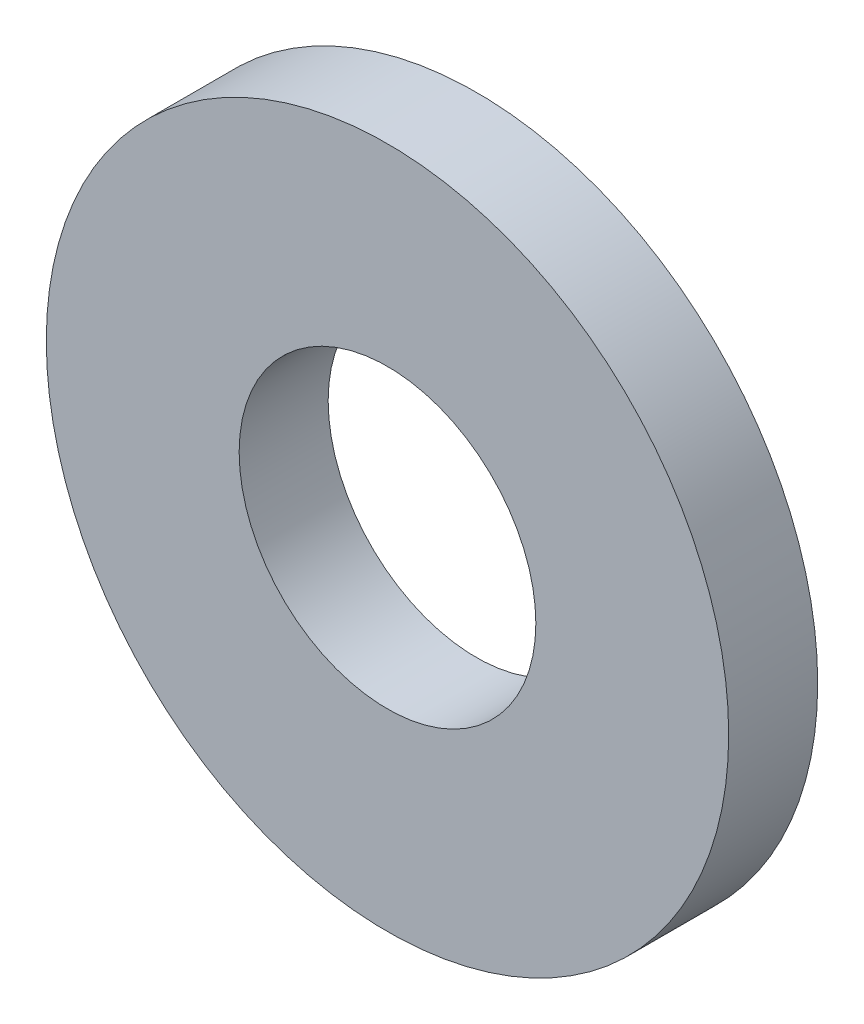
ISO-10303-21;
HEADER;
FILE_DESCRIPTION(('STEP AP214'),'2;1');
FILE_NAME('part.step','',(''),(''),'','','');
FILE_SCHEMA(('AUTOMOTIVE_DESIGN { 1 0 10303 214 1 1 1 1 }'));
ENDSEC;
DATA;
#1=APPLICATION_CONTEXT('core data for automotive mechanical design processes');
#2=APPLICATION_PROTOCOL_DEFINITION('international standard','automotive_design',2000,#1);
#3=PRODUCT_CONTEXT('',#1,'mechanical');
#4=PRODUCT('Part','Part','',(#3));
#5=PRODUCT_RELATED_PRODUCT_CATEGORY('part','',(#4));
#6=PRODUCT_DEFINITION_FORMATION('','',#4);
#7=PRODUCT_DEFINITION_CONTEXT('part definition',#1,'design');
#8=PRODUCT_DEFINITION('design','',#6,#7);
#9=PRODUCT_DEFINITION_SHAPE('','',#8);
#10=(LENGTH_UNIT() NAMED_UNIT(*) SI_UNIT(.MILLI.,.METRE.));
#11=(NAMED_UNIT(*) PLANE_ANGLE_UNIT() SI_UNIT($,.RADIAN.));
#12=(NAMED_UNIT(*) SI_UNIT($,.STERADIAN.) SOLID_ANGLE_UNIT());
#13=UNCERTAINTY_MEASURE_WITH_UNIT(LENGTH_MEASURE(1.E-05),#10,'distance_accuracy_value','');
#14=(GEOMETRIC_REPRESENTATION_CONTEXT(3) GLOBAL_UNCERTAINTY_ASSIGNED_CONTEXT((#13)) GLOBAL_UNIT_ASSIGNED_CONTEXT((#10,
#11,#12)) REPRESENTATION_CONTEXT('',''));
#15=CARTESIAN_POINT('',(0.,0.,0.));
#16=DIRECTION('',(0.,0.,1.));
#17=DIRECTION('',(1.,0.,0.));
#18=AXIS2_PLACEMENT_3D('',#15,#16,#17);
#19=CARTESIAN_POINT('',(0.,0.,0.));
#20=DIRECTION('',(0.,0.,1.));
#21=DIRECTION('',(1.,0.,0.));
#22=AXIS2_PLACEMENT_3D('',#19,#20,#21);
#23=PLANE('',#22);
#24=CARTESIAN_POINT('',(0.,0.,0.));
#25=DIRECTION('',(0.,0.,1.));
#26=DIRECTION('',(1.,0.,0.));
#27=AXIS2_PLACEMENT_3D('',#24,#25,#26);
#28=CIRCLE('',#27,5.);
#29=CARTESIAN_POINT('',(5.,0.,0.));
#30=VERTEX_POINT('',#29);
#31=EDGE_CURVE('E744',#30,#30,#28,.T.);
#32=ORIENTED_EDGE('',*,*,#31,.T.);
#33=EDGE_LOOP('',(#32));
#34=FACE_BOUND('',#33,.T.);
#35=DIRECTION('',(-0.500000000000006,-0.866025403784435,0.));
#36=VECTOR('',#35,1.);
#37=CARTESIAN_POINT('',(-1.58771324027151,-5.24999999999999,0.));
#38=LINE('',#37,#36);
#39=CARTESIAN_POINT('',(-1.58771324027151,-5.24999999999999,0.));
#40=VERTEX_POINT('',#39);
#41=CARTESIAN_POINT('',(-3.175426480543,-7.99999999999998,0.));
#42=VERTEX_POINT('',#41);
#43=EDGE_CURVE('E63',#40,#42,#38,.T.);
#44=ORIENTED_EDGE('',*,*,#43,.T.);
#45=DIRECTION('',(0.499999999999994,-0.866025403784442,0.));
#46=VECTOR('',#45,1.);
#47=CARTESIAN_POINT('',(-3.175426480543,-7.99999999999998,0.));
#48=LINE('',#47,#46);
#49=CARTESIAN_POINT('',(-1.58771324027154,-10.75,0.));
#50=VERTEX_POINT('',#49);
#51=EDGE_CURVE('E267',#42,#50,#48,.T.);
#52=ORIENTED_EDGE('',*,*,#51,.T.);
#53=DIRECTION('',(1.,0.,0.));
#54=VECTOR('',#53,1.);
#55=CARTESIAN_POINT('',(-1.58771324027154,-10.75,0.));
#56=LINE('',#55,#54);
#57=CARTESIAN_POINT('',(1.5877132402714,-10.75,0.));
#58=VERTEX_POINT('',#57);
#59=EDGE_CURVE('E271',#50,#58,#56,.T.);
#60=ORIENTED_EDGE('',*,*,#59,.T.);
#61=DIRECTION('',(0.500000000000006,0.866025403784435,0.));
#62=VECTOR('',#61,1.);
#63=CARTESIAN_POINT('',(1.5877132402714,-10.75,0.));
#64=LINE('',#63,#62);
#65=CARTESIAN_POINT('',(3.17542648054289,-8.00000000000002,0.));
#66=VERTEX_POINT('',#65);
#67=EDGE_CURVE('E275',#58,#66,#64,.T.);
#68=ORIENTED_EDGE('',*,*,#67,.T.);
#69=DIRECTION('',(-0.499999999999994,0.866025403784442,0.));
#70=VECTOR('',#69,1.);
#71=CARTESIAN_POINT('',(3.17542648054289,-8.00000000000002,0.));
#72=LINE('',#71,#70);
#73=CARTESIAN_POINT('',(1.58771324027144,-5.25000000000001,0.));
#74=VERTEX_POINT('',#73);
#75=EDGE_CURVE('E279',#66,#74,#72,.T.);
#76=ORIENTED_EDGE('',*,*,#75,.T.);
#77=DIRECTION('',(-1.,0.,0.));
#78=VECTOR('',#77,1.);
#79=CARTESIAN_POINT('',(1.58771324027144,-5.25000000000001,0.));
#80=LINE('',#79,#78);
#81=EDGE_CURVE('E244',#74,#40,#80,.T.);
#82=ORIENTED_EDGE('',*,*,#81,.T.);
#83=EDGE_LOOP('',(#44,#52,#60,#68,#76,#82));
#84=FACE_BOUND('',#83,.T.);
#85=DIRECTION('',(0.5,0.866025403784439,0.));
#86=VECTOR('',#85,1.);
#87=CARTESIAN_POINT('',(1.58771324027147,5.25,0.));
#88=LINE('',#87,#86);
#89=CARTESIAN_POINT('',(1.58771324027147,5.25,0.));
#90=VERTEX_POINT('',#89);
#91=CARTESIAN_POINT('',(3.17542648054294,8.,0.));
#92=VERTEX_POINT('',#91);
#93=EDGE_CURVE('E371',#90,#92,#88,.T.);
#94=ORIENTED_EDGE('',*,*,#93,.T.);
#95=DIRECTION('',(-0.5,0.866025403784438,0.));
#96=VECTOR('',#95,1.);
#97=CARTESIAN_POINT('',(3.17542648054294,8.,0.));
#98=LINE('',#97,#96);
#99=CARTESIAN_POINT('',(1.58771324027147,10.75,0.));
#100=VERTEX_POINT('',#99);
#101=EDGE_CURVE('E401',#92,#100,#98,.T.);
#102=ORIENTED_EDGE('',*,*,#101,.T.);
#103=DIRECTION('',(-1.,0.,0.));
#104=VECTOR('',#103,1.);
#105=CARTESIAN_POINT('',(1.58771324027147,10.75,0.));
#106=LINE('',#105,#104);
#107=CARTESIAN_POINT('',(-1.58771324027147,10.75,0.));
#108=VERTEX_POINT('',#107);
#109=EDGE_CURVE('E405',#100,#108,#106,.T.);
#110=ORIENTED_EDGE('',*,*,#109,.T.);
#111=DIRECTION('',(-0.5,-0.866025403784439,0.));
#112=VECTOR('',#111,1.);
#113=CARTESIAN_POINT('',(-1.58771324027147,10.75,0.));
#114=LINE('',#113,#112);
#115=CARTESIAN_POINT('',(-3.17542648054294,8.,0.));
#116=VERTEX_POINT('',#115);
#117=EDGE_CURVE('E409',#108,#116,#114,.T.);
#118=ORIENTED_EDGE('',*,*,#117,.T.);
#119=DIRECTION('',(0.5,-0.866025403784438,0.));
#120=VECTOR('',#119,1.);
#121=CARTESIAN_POINT('',(-3.17542648054294,8.,0.));
#122=LINE('',#121,#120);
#123=CARTESIAN_POINT('',(-1.58771324027147,5.25,0.));
#124=VERTEX_POINT('',#123);
#125=EDGE_CURVE('E413',#116,#124,#122,.T.);
#126=ORIENTED_EDGE('',*,*,#125,.T.);
#127=DIRECTION('',(1.,0.,0.));
#128=VECTOR('',#127,1.);
#129=CARTESIAN_POINT('',(-1.58771324027147,5.25,0.));
#130=LINE('',#129,#128);
#131=EDGE_CURVE('E377',#124,#90,#130,.T.);
#132=ORIENTED_EDGE('',*,*,#131,.T.);
#133=EDGE_LOOP('',(#94,#102,#110,#118,#126,#132));
#134=FACE_BOUND('',#133,.T.);
#135=CARTESIAN_POINT('',(0.,0.,0.));
#136=DIRECTION('',(0.,0.,1.));
#137=DIRECTION('',(1.,0.,0.));
#138=AXIS2_PLACEMENT_3D('',#135,#136,#137);
#139=CIRCLE('',#138,11.5);
#140=CARTESIAN_POINT('',(11.5,0.,0.));
#141=VERTEX_POINT('',#140);
#142=EDGE_CURVE('E11',#141,#141,#139,.T.);
#143=ORIENTED_EDGE('',*,*,#142,.F.);
#144=EDGE_LOOP('',(#143));
#145=FACE_BOUND('',#144,.T.);
#146=DIRECTION('',(0.866025403784437,-0.500000000000003,0.));
#147=VECTOR('',#146,1.);
#148=CARTESIAN_POINT('',(5.24999999999999,-1.58771324027149,0.));
#149=LINE('',#148,#147);
#150=CARTESIAN_POINT('',(5.24999999999999,-1.58771324027149,0.));
#151=VERTEX_POINT('',#150);
#152=CARTESIAN_POINT('',(7.99999999999999,-3.17542648054297,0.));
#153=VERTEX_POINT('',#152);
#154=EDGE_CURVE('E303',#151,#153,#149,.T.);
#155=ORIENTED_EDGE('',*,*,#154,.T.);
#156=DIRECTION('',(0.86602540378444,0.499999999999997,0.));
#157=VECTOR('',#156,1.);
#158=CARTESIAN_POINT('',(7.99999999999999,-3.17542648054297,0.));
#159=LINE('',#158,#157);
#160=CARTESIAN_POINT('',(10.75,-1.58771324027151,0.));
#161=VERTEX_POINT('',#160);
#162=EDGE_CURVE('E333',#153,#161,#159,.T.);
#163=ORIENTED_EDGE('',*,*,#162,.T.);
#164=DIRECTION('',(0.,1.,0.));
#165=VECTOR('',#164,1.);
#166=CARTESIAN_POINT('',(10.75,-1.58771324027151,0.));
#167=LINE('',#166,#165);
#168=CARTESIAN_POINT('',(10.75,1.58771324027143,0.));
#169=VERTEX_POINT('',#168);
#170=EDGE_CURVE('E337',#161,#169,#167,.T.);
#171=ORIENTED_EDGE('',*,*,#170,.T.);
#172=DIRECTION('',(-0.866025403784437,0.500000000000003,0.));
#173=VECTOR('',#172,1.);
#174=CARTESIAN_POINT('',(10.75,1.58771324027143,0.));
#175=LINE('',#174,#173);
#176=CARTESIAN_POINT('',(8.00000000000001,3.17542648054292,0.));
#177=VERTEX_POINT('',#176);
#178=EDGE_CURVE('E341',#169,#177,#175,.T.);
#179=ORIENTED_EDGE('',*,*,#178,.T.);
#180=DIRECTION('',(-0.86602540378444,-0.499999999999997,0.));
#181=VECTOR('',#180,1.);
#182=CARTESIAN_POINT('',(8.00000000000001,3.17542648054292,0.));
#183=LINE('',#182,#181);
#184=CARTESIAN_POINT('',(5.25,1.58771324027145,0.));
#185=VERTEX_POINT('',#184);
#186=EDGE_CURVE('E345',#177,#185,#183,.T.);
#187=ORIENTED_EDGE('',*,*,#186,.T.);
#188=DIRECTION('',(0.,-1.,0.));
#189=VECTOR('',#188,1.);
#190=CARTESIAN_POINT('',(5.25,1.58771324027145,0.));
#191=LINE('',#190,#189);
#192=EDGE_CURVE('E309',#185,#151,#191,.T.);
#193=ORIENTED_EDGE('',*,*,#192,.T.);
#194=EDGE_LOOP('',(#155,#163,#171,#179,#187,#193));
#195=FACE_BOUND('',#194,.T.);
#196=DIRECTION('',(-0.866025403784433,0.500000000000009,0.));
#197=VECTOR('',#196,1.);
#198=CARTESIAN_POINT('',(-5.24999999999998,1.58771324027153,0.));
#199=LINE('',#198,#197);
#200=CARTESIAN_POINT('',(-5.24999999999998,1.58771324027153,0.));
#201=VERTEX_POINT('',#200);
#202=CARTESIAN_POINT('',(-7.99999999999997,3.17542648054303,0.));
#203=VERTEX_POINT('',#202);
#204=EDGE_CURVE('E55',#201,#203,#199,.T.);
#205=ORIENTED_EDGE('',*,*,#204,.T.);
#206=DIRECTION('',(-0.866025403784444,-0.499999999999991,0.));
#207=VECTOR('',#206,1.);
#208=CARTESIAN_POINT('',(-7.99999999999997,3.17542648054303,0.));
#209=LINE('',#208,#207);
#210=CARTESIAN_POINT('',(-10.75,1.58771324027158,0.));
#211=VERTEX_POINT('',#210);
#212=EDGE_CURVE('E770',#203,#211,#209,.T.);
#213=ORIENTED_EDGE('',*,*,#212,.T.);
#214=DIRECTION('',(0.,-1.,0.));
#215=VECTOR('',#214,1.);
#216=CARTESIAN_POINT('',(-10.75,1.58771324027158,0.));
#217=LINE('',#216,#215);
#218=CARTESIAN_POINT('',(-10.75,-1.58771324027136,0.));
#219=VERTEX_POINT('',#218);
#220=EDGE_CURVE('E227',#211,#219,#217,.T.);
#221=ORIENTED_EDGE('',*,*,#220,.T.);
#222=DIRECTION('',(0.866025403784434,-0.500000000000009,0.));
#223=VECTOR('',#222,1.);
#224=CARTESIAN_POINT('',(-10.75,-1.58771324027136,0.));
#225=LINE('',#224,#223);
#226=CARTESIAN_POINT('',(-8.00000000000003,-3.17542648054286,0.));
#227=VERTEX_POINT('',#226);
#228=EDGE_CURVE('E775',#219,#227,#225,.T.);
#229=ORIENTED_EDGE('',*,*,#228,.T.);
#230=DIRECTION('',(0.866025403784444,0.499999999999991,0.));
#231=VECTOR('',#230,1.);
#232=CARTESIAN_POINT('',(-8.00000000000003,-3.17542648054286,0.));
#233=LINE('',#232,#231);
#234=CARTESIAN_POINT('',(-5.25000000000001,-1.58771324027142,0.));
#235=VERTEX_POINT('',#234);
#236=EDGE_CURVE('E779',#227,#235,#233,.T.);
#237=ORIENTED_EDGE('',*,*,#236,.T.);
#238=DIRECTION('',(0.,1.,0.));
#239=VECTOR('',#238,1.);
#240=CARTESIAN_POINT('',(-5.25000000000001,-1.58771324027142,0.));
#241=LINE('',#240,#239);
#242=EDGE_CURVE('E755',#235,#201,#241,.T.);
#243=ORIENTED_EDGE('',*,*,#242,.T.);
#244=EDGE_LOOP('',(#205,#213,#221,#229,#237,#243));
#245=FACE_BOUND('',#244,.T.);
#246=ADVANCED_FACE('F39',(#34,#84,#134,#145,#195,#245),#23,.F.);
#247=CARTESIAN_POINT('',(0.,0.,2.3));
#248=DIRECTION('',(0.,0.,-1.));
#249=DIRECTION('',(-1.,0.,0.));
#250=AXIS2_PLACEMENT_3D('',#247,#248,#249);
#251=CYLINDRICAL_SURFACE('',#250,11.5);
#252=ORIENTED_EDGE('',*,*,#142,.T.);
#253=EDGE_LOOP('',(#252));
#254=FACE_BOUND('',#253,.T.);
#255=CARTESIAN_POINT('',(0.,0.,3.));
#256=DIRECTION('',(0.,0.,1.));
#257=DIRECTION('',(1.,0.,0.));
#258=AXIS2_PLACEMENT_3D('',#255,#256,#257);
#259=CIRCLE('',#258,11.5);
#260=CARTESIAN_POINT('',(11.5,0.,3.));
#261=VERTEX_POINT('',#260);
#262=EDGE_CURVE('E746',#261,#261,#259,.T.);
#263=ORIENTED_EDGE('',*,*,#262,.F.);
#264=EDGE_LOOP('',(#263));
#265=FACE_BOUND('',#264,.T.);
#266=ADVANCED_FACE('F41',(#254,#265),#251,.T.);
#267=CARTESIAN_POINT('',(1.58771324027147,5.25,2.3));
#268=DIRECTION('',(-0.866025403784439,0.5,0.));
#269=DIRECTION('',(-0.5,-0.866025403784439,0.));
#270=AXIS2_PLACEMENT_3D('',#267,#268,#269);
#271=PLANE('',#270);
#272=ORIENTED_EDGE('',*,*,#93,.F.);
#273=DIRECTION('',(0.,0.,-1.));
#274=VECTOR('',#273,1.);
#275=CARTESIAN_POINT('',(1.58771324027147,5.25,2.3));
#276=LINE('',#275,#274);
#277=CARTESIAN_POINT('',(1.58771324027147,5.25,2.3));
#278=VERTEX_POINT('',#277);
#279=EDGE_CURVE('E397',#278,#90,#276,.T.);
#280=ORIENTED_EDGE('',*,*,#279,.F.);
#281=DIRECTION('',(0.5,0.866025403784439,0.));
#282=VECTOR('',#281,1.);
#283=CARTESIAN_POINT('',(1.58771324027147,5.25,2.3));
#284=LINE('',#283,#282);
#285=CARTESIAN_POINT('',(3.17542648054294,8.,2.3));
#286=VERTEX_POINT('',#285);
#287=EDGE_CURVE('E372',#278,#286,#284,.T.);
#288=ORIENTED_EDGE('',*,*,#287,.T.);
#289=DIRECTION('',(0.,0.,-1.));
#290=VECTOR('',#289,1.);
#291=CARTESIAN_POINT('',(3.17542648054294,8.,2.3));
#292=LINE('',#291,#290);
#293=EDGE_CURVE('E48',#286,#92,#292,.T.);
#294=ORIENTED_EDGE('',*,*,#293,.T.);
#295=EDGE_LOOP('',(#272,#280,#288,#294));
#296=FACE_BOUND('',#295,.T.);
#297=ADVANCED_FACE('F438',(#296),#271,.T.);
#298=CARTESIAN_POINT('',(3.17542648054294,8.,2.3));
#299=DIRECTION('',(-0.866025403784439,-0.5,0.));
#300=DIRECTION('',(0.5,-0.866025403784439,0.));
#301=AXIS2_PLACEMENT_3D('',#298,#299,#300);
#302=PLANE('',#301);
#303=ORIENTED_EDGE('',*,*,#101,.F.);
#304=ORIENTED_EDGE('',*,*,#293,.F.);
#305=DIRECTION('',(-0.5,0.866025403784438,0.));
#306=VECTOR('',#305,1.);
#307=CARTESIAN_POINT('',(3.17542648054294,8.,2.3));
#308=LINE('',#307,#306);
#309=CARTESIAN_POINT('',(1.58771324027147,10.75,2.3));
#310=VERTEX_POINT('',#309);
#311=EDGE_CURVE('E376',#286,#310,#308,.T.);
#312=ORIENTED_EDGE('',*,*,#311,.T.);
#313=DIRECTION('',(0.,0.,-1.));
#314=VECTOR('',#313,1.);
#315=CARTESIAN_POINT('',(1.58771324027147,10.75,2.3));
#316=LINE('',#315,#314);
#317=EDGE_CURVE('E432',#310,#100,#316,.T.);
#318=ORIENTED_EDGE('',*,*,#317,.T.);
#319=EDGE_LOOP('',(#303,#304,#312,#318));
#320=FACE_BOUND('',#319,.T.);
#321=ADVANCED_FACE('F451',(#320),#302,.T.);
#322=CARTESIAN_POINT('',(1.58771324027147,10.75,2.3));
#323=DIRECTION('',(0.,-1.,0.));
#324=DIRECTION('',(0.,0.,-1.));
#325=AXIS2_PLACEMENT_3D('',#322,#323,#324);
#326=PLANE('',#325);
#327=ORIENTED_EDGE('',*,*,#109,.F.);
#328=ORIENTED_EDGE('',*,*,#317,.F.);
#329=DIRECTION('',(-1.,0.,0.));
#330=VECTOR('',#329,1.);
#331=CARTESIAN_POINT('',(1.58771324027147,10.75,2.3));
#332=LINE('',#331,#330);
#333=CARTESIAN_POINT('',(-1.58771324027147,10.75,2.3));
#334=VERTEX_POINT('',#333);
#335=EDGE_CURVE('E381',#310,#334,#332,.T.);
#336=ORIENTED_EDGE('',*,*,#335,.T.);
#337=DIRECTION('',(0.,0.,-1.));
#338=VECTOR('',#337,1.);
#339=CARTESIAN_POINT('',(-1.58771324027147,10.75,2.3));
#340=LINE('',#339,#338);
#341=EDGE_CURVE('E429',#334,#108,#340,.T.);
#342=ORIENTED_EDGE('',*,*,#341,.T.);
#343=EDGE_LOOP('',(#327,#328,#336,#342));
#344=FACE_BOUND('',#343,.T.);
#345=ADVANCED_FACE('F454',(#344),#326,.T.);
#346=CARTESIAN_POINT('',(-1.58771324027147,10.75,2.3));
#347=DIRECTION('',(0.866025403784439,-0.5,0.));
#348=DIRECTION('',(0.5,0.866025403784439,0.));
#349=AXIS2_PLACEMENT_3D('',#346,#347,#348);
#350=PLANE('',#349);
#351=ORIENTED_EDGE('',*,*,#117,.F.);
#352=ORIENTED_EDGE('',*,*,#341,.F.);
#353=DIRECTION('',(-0.5,-0.866025403784439,0.));
#354=VECTOR('',#353,1.);
#355=CARTESIAN_POINT('',(-1.58771324027147,10.75,2.3));
#356=LINE('',#355,#354);
#357=CARTESIAN_POINT('',(-3.17542648054294,8.,2.3));
#358=VERTEX_POINT('',#357);
#359=EDGE_CURVE('E385',#334,#358,#356,.T.);
#360=ORIENTED_EDGE('',*,*,#359,.T.);
#361=DIRECTION('',(0.,0.,-1.));
#362=VECTOR('',#361,1.);
#363=CARTESIAN_POINT('',(-3.17542648054294,8.,2.3));
#364=LINE('',#363,#362);
#365=EDGE_CURVE('E426',#358,#116,#364,.T.);
#366=ORIENTED_EDGE('',*,*,#365,.T.);
#367=EDGE_LOOP('',(#351,#352,#360,#366));
#368=FACE_BOUND('',#367,.T.);
#369=ADVANCED_FACE('F458',(#368),#350,.T.);
#370=CARTESIAN_POINT('',(-3.17542648054294,8.,2.3));
#371=DIRECTION('',(0.866025403784439,0.5,0.));
#372=DIRECTION('',(-0.5,0.866025403784439,0.));
#373=AXIS2_PLACEMENT_3D('',#370,#371,#372);
#374=PLANE('',#373);
#375=ORIENTED_EDGE('',*,*,#125,.F.);
#376=ORIENTED_EDGE('',*,*,#365,.F.);
#377=DIRECTION('',(0.5,-0.866025403784438,0.));
#378=VECTOR('',#377,1.);
#379=CARTESIAN_POINT('',(-3.17542648054294,8.,2.3));
#380=LINE('',#379,#378);
#381=CARTESIAN_POINT('',(-1.58771324027147,5.25,2.3));
#382=VERTEX_POINT('',#381);
#383=EDGE_CURVE('E389',#358,#382,#380,.T.);
#384=ORIENTED_EDGE('',*,*,#383,.T.);
#385=DIRECTION('',(0.,0.,-1.));
#386=VECTOR('',#385,1.);
#387=CARTESIAN_POINT('',(-1.58771324027147,5.25,2.3));
#388=LINE('',#387,#386);
#389=EDGE_CURVE('E423',#382,#124,#388,.T.);
#390=ORIENTED_EDGE('',*,*,#389,.T.);
#391=EDGE_LOOP('',(#375,#376,#384,#390));
#392=FACE_BOUND('',#391,.T.);
#393=ADVANCED_FACE('F461',(#392),#374,.T.);
#394=CARTESIAN_POINT('',(-1.58771324027147,5.25,2.3));
#395=DIRECTION('',(0.,1.,0.));
#396=DIRECTION('',(0.,0.,1.));
#397=AXIS2_PLACEMENT_3D('',#394,#395,#396);
#398=PLANE('',#397);
#399=ORIENTED_EDGE('',*,*,#131,.F.);
#400=ORIENTED_EDGE('',*,*,#389,.F.);
#401=DIRECTION('',(1.,0.,0.));
#402=VECTOR('',#401,1.);
#403=CARTESIAN_POINT('',(-1.58771324027147,5.25,2.3));
#404=LINE('',#403,#402);
#405=EDGE_CURVE('E393',#382,#278,#404,.T.);
#406=ORIENTED_EDGE('',*,*,#405,.T.);
#407=ORIENTED_EDGE('',*,*,#279,.T.);
#408=EDGE_LOOP('',(#399,#400,#406,#407));
#409=FACE_BOUND('',#408,.T.);
#410=ADVANCED_FACE('F447',(#409),#398,.T.);
#411=CARTESIAN_POINT('',(5.24999999999999,-1.58771324027149,2.3));
#412=DIRECTION('',(0.500000000000003,0.866025403784437,0.));
#413=DIRECTION('',(-0.866025403784437,0.500000000000003,0.));
#414=AXIS2_PLACEMENT_3D('',#411,#412,#413);
#415=PLANE('',#414);
#416=ORIENTED_EDGE('',*,*,#154,.F.);
#417=DIRECTION('',(0.,0.,-1.));
#418=VECTOR('',#417,1.);
#419=CARTESIAN_POINT('',(5.24999999999999,-1.58771324027149,2.3));
#420=LINE('',#419,#418);
#421=CARTESIAN_POINT('',(5.24999999999999,-1.58771324027149,2.3));
#422=VERTEX_POINT('',#421);
#423=EDGE_CURVE('E329',#422,#151,#420,.T.);
#424=ORIENTED_EDGE('',*,*,#423,.F.);
#425=DIRECTION('',(0.866025403784437,-0.500000000000003,0.));
#426=VECTOR('',#425,1.);
#427=CARTESIAN_POINT('',(5.24999999999999,-1.58771324027149,2.3));
#428=LINE('',#427,#426);
#429=CARTESIAN_POINT('',(7.99999999999999,-3.17542648054297,2.3));
#430=VERTEX_POINT('',#429);
#431=EDGE_CURVE('E304',#422,#430,#428,.T.);
#432=ORIENTED_EDGE('',*,*,#431,.T.);
#433=DIRECTION('',(0.,0.,-1.));
#434=VECTOR('',#433,1.);
#435=CARTESIAN_POINT('',(7.99999999999999,-3.17542648054297,2.3));
#436=LINE('',#435,#434);
#437=EDGE_CURVE('E367',#430,#153,#436,.T.);
#438=ORIENTED_EDGE('',*,*,#437,.T.);
#439=EDGE_LOOP('',(#416,#424,#432,#438));
#440=FACE_BOUND('',#439,.T.);
#441=ADVANCED_FACE('F468',(#440),#415,.T.);
#442=CARTESIAN_POINT('',(7.99999999999999,-3.17542648054297,2.3));
#443=DIRECTION('',(-0.499999999999997,0.86602540378444,0.));
#444=DIRECTION('',(-0.86602540378444,-0.499999999999997,0.));
#445=AXIS2_PLACEMENT_3D('',#442,#443,#444);
#446=PLANE('',#445);
#447=ORIENTED_EDGE('',*,*,#162,.F.);
#448=ORIENTED_EDGE('',*,*,#437,.F.);
#449=DIRECTION('',(0.86602540378444,0.499999999999997,0.));
#450=VECTOR('',#449,1.);
#451=CARTESIAN_POINT('',(7.99999999999999,-3.17542648054297,2.3));
#452=LINE('',#451,#450);
#453=CARTESIAN_POINT('',(10.75,-1.58771324027151,2.3));
#454=VERTEX_POINT('',#453);
#455=EDGE_CURVE('E308',#430,#454,#452,.T.);
#456=ORIENTED_EDGE('',*,*,#455,.T.);
#457=DIRECTION('',(0.,0.,-1.));
#458=VECTOR('',#457,1.);
#459=CARTESIAN_POINT('',(10.75,-1.58771324027151,2.3));
#460=LINE('',#459,#458);
#461=EDGE_CURVE('E364',#454,#161,#460,.T.);
#462=ORIENTED_EDGE('',*,*,#461,.T.);
#463=EDGE_LOOP('',(#447,#448,#456,#462));
#464=FACE_BOUND('',#463,.T.);
#465=ADVANCED_FACE('F512',(#464),#446,.T.);
#466=CARTESIAN_POINT('',(10.75,-1.58771324027151,2.3));
#467=DIRECTION('',(-1.,0.,0.));
#468=DIRECTION('',(0.,-1.,0.));
#469=AXIS2_PLACEMENT_3D('',#466,#467,#468);
#470=PLANE('',#469);
#471=ORIENTED_EDGE('',*,*,#170,.F.);
#472=ORIENTED_EDGE('',*,*,#461,.F.);
#473=DIRECTION('',(0.,1.,0.));
#474=VECTOR('',#473,1.);
#475=CARTESIAN_POINT('',(10.75,-1.58771324027151,2.3));
#476=LINE('',#475,#474);
#477=CARTESIAN_POINT('',(10.75,1.58771324027143,2.3));
#478=VERTEX_POINT('',#477);
#479=EDGE_CURVE('E313',#454,#478,#476,.T.);
#480=ORIENTED_EDGE('',*,*,#479,.T.);
#481=DIRECTION('',(0.,0.,-1.));
#482=VECTOR('',#481,1.);
#483=CARTESIAN_POINT('',(10.75,1.58771324027143,2.3));
#484=LINE('',#483,#482);
#485=EDGE_CURVE('E361',#478,#169,#484,.T.);
#486=ORIENTED_EDGE('',*,*,#485,.T.);
#487=EDGE_LOOP('',(#471,#472,#480,#486));
#488=FACE_BOUND('',#487,.T.);
#489=ADVANCED_FACE('F522',(#488),#470,.T.);
#490=CARTESIAN_POINT('',(10.75,1.58771324027143,2.3));
#491=DIRECTION('',(-0.500000000000003,-0.866025403784437,0.));
#492=DIRECTION('',(0.866025403784437,-0.500000000000003,0.));
#493=AXIS2_PLACEMENT_3D('',#490,#491,#492);
#494=PLANE('',#493);
#495=ORIENTED_EDGE('',*,*,#178,.F.);
#496=ORIENTED_EDGE('',*,*,#485,.F.);
#497=DIRECTION('',(-0.866025403784437,0.500000000000003,0.));
#498=VECTOR('',#497,1.);
#499=CARTESIAN_POINT('',(10.75,1.58771324027143,2.3));
#500=LINE('',#499,#498);
#501=CARTESIAN_POINT('',(8.00000000000001,3.17542648054292,2.3));
#502=VERTEX_POINT('',#501);
#503=EDGE_CURVE('E317',#478,#502,#500,.T.);
#504=ORIENTED_EDGE('',*,*,#503,.T.);
#505=DIRECTION('',(0.,0.,-1.));
#506=VECTOR('',#505,1.);
#507=CARTESIAN_POINT('',(8.00000000000001,3.17542648054292,2.3));
#508=LINE('',#507,#506);
#509=EDGE_CURVE('E358',#502,#177,#508,.T.);
#510=ORIENTED_EDGE('',*,*,#509,.T.);
#511=EDGE_LOOP('',(#495,#496,#504,#510));
#512=FACE_BOUND('',#511,.T.);
#513=ADVANCED_FACE('F532',(#512),#494,.T.);
#514=CARTESIAN_POINT('',(8.00000000000001,3.17542648054292,2.3));
#515=DIRECTION('',(0.499999999999997,-0.86602540378444,0.));
#516=DIRECTION('',(0.86602540378444,0.499999999999997,0.));
#517=AXIS2_PLACEMENT_3D('',#514,#515,#516);
#518=PLANE('',#517);
#519=ORIENTED_EDGE('',*,*,#186,.F.);
#520=ORIENTED_EDGE('',*,*,#509,.F.);
#521=DIRECTION('',(-0.86602540378444,-0.499999999999997,0.));
#522=VECTOR('',#521,1.);
#523=CARTESIAN_POINT('',(8.00000000000001,3.17542648054292,2.3));
#524=LINE('',#523,#522);
#525=CARTESIAN_POINT('',(5.25,1.58771324027145,2.3));
#526=VERTEX_POINT('',#525);
#527=EDGE_CURVE('E321',#502,#526,#524,.T.);
#528=ORIENTED_EDGE('',*,*,#527,.T.);
#529=DIRECTION('',(0.,0.,-1.));
#530=VECTOR('',#529,1.);
#531=CARTESIAN_POINT('',(5.25,1.58771324027145,2.3));
#532=LINE('',#531,#530);
#533=EDGE_CURVE('E355',#526,#185,#532,.T.);
#534=ORIENTED_EDGE('',*,*,#533,.T.);
#535=EDGE_LOOP('',(#519,#520,#528,#534));
#536=FACE_BOUND('',#535,.T.);
#537=ADVANCED_FACE('F542',(#536),#518,.T.);
#538=CARTESIAN_POINT('',(5.25,1.58771324027145,2.3));
#539=DIRECTION('',(1.,0.,0.));
#540=DIRECTION('',(0.,1.,0.));
#541=AXIS2_PLACEMENT_3D('',#538,#539,#540);
#542=PLANE('',#541);
#543=ORIENTED_EDGE('',*,*,#192,.F.);
#544=ORIENTED_EDGE('',*,*,#533,.F.);
#545=DIRECTION('',(0.,-1.,0.));
#546=VECTOR('',#545,1.);
#547=CARTESIAN_POINT('',(5.25,1.58771324027145,2.3));
#548=LINE('',#547,#546);
#549=EDGE_CURVE('E325',#526,#422,#548,.T.);
#550=ORIENTED_EDGE('',*,*,#549,.T.);
#551=ORIENTED_EDGE('',*,*,#423,.T.);
#552=EDGE_LOOP('',(#543,#544,#550,#551));
#553=FACE_BOUND('',#552,.T.);
#554=ADVANCED_FACE('F552',(#553),#542,.T.);
#555=CARTESIAN_POINT('',(-1.58771324027151,-5.24999999999999,2.3));
#556=DIRECTION('',(0.866025403784435,-0.500000000000006,0.));
#557=DIRECTION('',(0.500000000000006,0.866025403784435,0.));
#558=AXIS2_PLACEMENT_3D('',#555,#556,#557);
#559=PLANE('',#558);
#560=ORIENTED_EDGE('',*,*,#43,.F.);
#561=DIRECTION('',(0.,0.,-1.));
#562=VECTOR('',#561,1.);
#563=CARTESIAN_POINT('',(-1.58771324027151,-5.24999999999999,2.3));
#564=LINE('',#563,#562);
#565=CARTESIAN_POINT('',(-1.58771324027151,-5.24999999999999,2.3));
#566=VERTEX_POINT('',#565);
#567=EDGE_CURVE('E264',#566,#40,#564,.T.);
#568=ORIENTED_EDGE('',*,*,#567,.F.);
#569=DIRECTION('',(-0.500000000000006,-0.866025403784435,0.));
#570=VECTOR('',#569,1.);
#571=CARTESIAN_POINT('',(-1.58771324027151,-5.24999999999999,2.3));
#572=LINE('',#571,#570);
#573=CARTESIAN_POINT('',(-3.175426480543,-7.99999999999998,2.3));
#574=VERTEX_POINT('',#573);
#575=EDGE_CURVE('E239',#566,#574,#572,.T.);
#576=ORIENTED_EDGE('',*,*,#575,.T.);
#577=DIRECTION('',(0.,0.,-1.));
#578=VECTOR('',#577,1.);
#579=CARTESIAN_POINT('',(-3.175426480543,-7.99999999999998,2.3));
#580=LINE('',#579,#578);
#581=EDGE_CURVE('E300',#574,#42,#580,.T.);
#582=ORIENTED_EDGE('',*,*,#581,.T.);
#583=EDGE_LOOP('',(#560,#568,#576,#582));
#584=FACE_BOUND('',#583,.T.);
#585=ADVANCED_FACE('F562',(#584),#559,.T.);
#586=CARTESIAN_POINT('',(-3.175426480543,-7.99999999999998,2.3));
#587=DIRECTION('',(0.866025403784442,0.499999999999994,0.));
#588=DIRECTION('',(-0.499999999999994,0.866025403784442,0.));
#589=AXIS2_PLACEMENT_3D('',#586,#587,#588);
#590=PLANE('',#589);
#591=ORIENTED_EDGE('',*,*,#51,.F.);
#592=ORIENTED_EDGE('',*,*,#581,.F.);
#593=DIRECTION('',(0.499999999999994,-0.866025403784442,0.));
#594=VECTOR('',#593,1.);
#595=CARTESIAN_POINT('',(-3.175426480543,-7.99999999999998,2.3));
#596=LINE('',#595,#594);
#597=CARTESIAN_POINT('',(-1.58771324027154,-10.75,2.3));
#598=VERTEX_POINT('',#597);
#599=EDGE_CURVE('E243',#574,#598,#596,.T.);
#600=ORIENTED_EDGE('',*,*,#599,.T.);
#601=DIRECTION('',(0.,0.,-1.));
#602=VECTOR('',#601,1.);
#603=CARTESIAN_POINT('',(-1.58771324027154,-10.75,2.3));
#604=LINE('',#603,#602);
#605=EDGE_CURVE('E297',#598,#50,#604,.T.);
#606=ORIENTED_EDGE('',*,*,#605,.T.);
#607=EDGE_LOOP('',(#591,#592,#600,#606));
#608=FACE_BOUND('',#607,.T.);
#609=ADVANCED_FACE('F572',(#608),#590,.T.);
#610=CARTESIAN_POINT('',(-1.58771324027154,-10.75,2.3));
#611=DIRECTION('',(0.,1.,0.));
#612=DIRECTION('',(-1.,0.,0.));
#613=AXIS2_PLACEMENT_3D('',#610,#611,#612);
#614=PLANE('',#613);
#615=ORIENTED_EDGE('',*,*,#59,.F.);
#616=ORIENTED_EDGE('',*,*,#605,.F.);
#617=DIRECTION('',(1.,0.,0.));
#618=VECTOR('',#617,1.);
#619=CARTESIAN_POINT('',(-1.58771324027154,-10.75,2.3));
#620=LINE('',#619,#618);
#621=CARTESIAN_POINT('',(1.5877132402714,-10.75,2.3));
#622=VERTEX_POINT('',#621);
#623=EDGE_CURVE('E248',#598,#622,#620,.T.);
#624=ORIENTED_EDGE('',*,*,#623,.T.);
#625=DIRECTION('',(0.,0.,-1.));
#626=VECTOR('',#625,1.);
#627=CARTESIAN_POINT('',(1.5877132402714,-10.75,2.3));
#628=LINE('',#627,#626);
#629=EDGE_CURVE('E294',#622,#58,#628,.T.);
#630=ORIENTED_EDGE('',*,*,#629,.T.);
#631=EDGE_LOOP('',(#615,#616,#624,#630));
#632=FACE_BOUND('',#631,.T.);
#633=ADVANCED_FACE('F581',(#632),#614,.T.);
#634=CARTESIAN_POINT('',(1.5877132402714,-10.75,2.3));
#635=DIRECTION('',(-0.866025403784435,0.500000000000006,0.));
#636=DIRECTION('',(-0.500000000000006,-0.866025403784435,0.));
#637=AXIS2_PLACEMENT_3D('',#634,#635,#636);
#638=PLANE('',#637);
#639=ORIENTED_EDGE('',*,*,#67,.F.);
#640=ORIENTED_EDGE('',*,*,#629,.F.);
#641=DIRECTION('',(0.500000000000006,0.866025403784435,0.));
#642=VECTOR('',#641,1.);
#643=CARTESIAN_POINT('',(1.5877132402714,-10.75,2.3));
#644=LINE('',#643,#642);
#645=CARTESIAN_POINT('',(3.17542648054289,-8.00000000000002,2.3));
#646=VERTEX_POINT('',#645);
#647=EDGE_CURVE('E252',#622,#646,#644,.T.);
#648=ORIENTED_EDGE('',*,*,#647,.T.);
#649=DIRECTION('',(0.,0.,-1.));
#650=VECTOR('',#649,1.);
#651=CARTESIAN_POINT('',(3.17542648054289,-8.00000000000002,2.3));
#652=LINE('',#651,#650);
#653=EDGE_CURVE('E291',#646,#66,#652,.T.);
#654=ORIENTED_EDGE('',*,*,#653,.T.);
#655=EDGE_LOOP('',(#639,#640,#648,#654));
#656=FACE_BOUND('',#655,.T.);
#657=ADVANCED_FACE('F591',(#656),#638,.T.);
#658=CARTESIAN_POINT('',(3.17542648054289,-8.00000000000002,2.3));
#659=DIRECTION('',(-0.866025403784442,-0.499999999999994,0.));
#660=DIRECTION('',(0.499999999999994,-0.866025403784442,0.));
#661=AXIS2_PLACEMENT_3D('',#658,#659,#660);
#662=PLANE('',#661);
#663=ORIENTED_EDGE('',*,*,#75,.F.);
#664=ORIENTED_EDGE('',*,*,#653,.F.);
#665=DIRECTION('',(-0.499999999999994,0.866025403784442,0.));
#666=VECTOR('',#665,1.);
#667=CARTESIAN_POINT('',(3.17542648054289,-8.00000000000002,2.3));
#668=LINE('',#667,#666);
#669=CARTESIAN_POINT('',(1.58771324027144,-5.25000000000001,2.3));
#670=VERTEX_POINT('',#669);
#671=EDGE_CURVE('E256',#646,#670,#668,.T.);
#672=ORIENTED_EDGE('',*,*,#671,.T.);
#673=DIRECTION('',(0.,0.,-1.));
#674=VECTOR('',#673,1.);
#675=CARTESIAN_POINT('',(1.58771324027144,-5.25000000000001,2.3));
#676=LINE('',#675,#674);
#677=EDGE_CURVE('E288',#670,#74,#676,.T.);
#678=ORIENTED_EDGE('',*,*,#677,.T.);
#679=EDGE_LOOP('',(#663,#664,#672,#678));
#680=FACE_BOUND('',#679,.T.);
#681=ADVANCED_FACE('F601',(#680),#662,.T.);
#682=CARTESIAN_POINT('',(1.58771324027144,-5.25000000000001,2.3));
#683=DIRECTION('',(0.,-1.,0.));
#684=DIRECTION('',(1.,0.,0.));
#685=AXIS2_PLACEMENT_3D('',#682,#683,#684);
#686=PLANE('',#685);
#687=ORIENTED_EDGE('',*,*,#81,.F.);
#688=ORIENTED_EDGE('',*,*,#677,.F.);
#689=DIRECTION('',(-1.,0.,0.));
#690=VECTOR('',#689,1.);
#691=CARTESIAN_POINT('',(1.58771324027144,-5.25000000000001,2.3));
#692=LINE('',#691,#690);
#693=EDGE_CURVE('E260',#670,#566,#692,.T.);
#694=ORIENTED_EDGE('',*,*,#693,.T.);
#695=ORIENTED_EDGE('',*,*,#567,.T.);
#696=EDGE_LOOP('',(#687,#688,#694,#695));
#697=FACE_BOUND('',#696,.T.);
#698=ADVANCED_FACE('F611',(#697),#686,.T.);
#699=CARTESIAN_POINT('',(-5.24999999999998,1.58771324027153,2.3));
#700=DIRECTION('',(-0.500000000000009,-0.866025403784434,0.));
#701=DIRECTION('',(0.866025403784434,-0.500000000000009,0.));
#702=AXIS2_PLACEMENT_3D('',#699,#700,#701);
#703=PLANE('',#702);
#704=ORIENTED_EDGE('',*,*,#204,.F.);
#705=DIRECTION('',(0.,0.,-1.));
#706=VECTOR('',#705,1.);
#707=CARTESIAN_POINT('',(-5.24999999999998,1.58771324027153,2.3));
#708=LINE('',#707,#706);
#709=CARTESIAN_POINT('',(-5.24999999999998,1.58771324027153,2.3));
#710=VERTEX_POINT('',#709);
#711=EDGE_CURVE('E767',#710,#201,#708,.T.);
#712=ORIENTED_EDGE('',*,*,#711,.F.);
#713=DIRECTION('',(-0.866025403784433,0.500000000000009,0.));
#714=VECTOR('',#713,1.);
#715=CARTESIAN_POINT('',(-5.24999999999998,1.58771324027153,2.3));
#716=LINE('',#715,#714);
#717=CARTESIAN_POINT('',(-7.99999999999997,3.17542648054303,2.3));
#718=VERTEX_POINT('',#717);
#719=EDGE_CURVE('E223',#710,#718,#716,.T.);
#720=ORIENTED_EDGE('',*,*,#719,.T.);
#721=DIRECTION('',(0.,0.,-1.));
#722=VECTOR('',#721,1.);
#723=CARTESIAN_POINT('',(-7.99999999999997,3.17542648054303,2.3));
#724=LINE('',#723,#722);
#725=EDGE_CURVE('E221',#718,#203,#724,.T.);
#726=ORIENTED_EDGE('',*,*,#725,.T.);
#727=EDGE_LOOP('',(#704,#712,#720,#726));
#728=FACE_BOUND('',#727,.T.);
#729=ADVANCED_FACE('F621',(#728),#703,.T.);
#730=CARTESIAN_POINT('',(-7.99999999999997,3.17542648054303,2.3));
#731=DIRECTION('',(0.499999999999991,-0.866025403784444,0.));
#732=DIRECTION('',(0.866025403784444,0.499999999999991,0.));
#733=AXIS2_PLACEMENT_3D('',#730,#731,#732);
#734=PLANE('',#733);
#735=ORIENTED_EDGE('',*,*,#212,.F.);
#736=ORIENTED_EDGE('',*,*,#725,.F.);
#737=DIRECTION('',(-0.866025403784444,-0.499999999999991,0.));
#738=VECTOR('',#737,1.);
#739=CARTESIAN_POINT('',(-7.99999999999997,3.17542648054303,2.3));
#740=LINE('',#739,#738);
#741=CARTESIAN_POINT('',(-10.75,1.58771324027158,2.3));
#742=VERTEX_POINT('',#741);
#743=EDGE_CURVE('E207',#718,#742,#740,.T.);
#744=ORIENTED_EDGE('',*,*,#743,.T.);
#745=DIRECTION('',(0.,0.,-1.));
#746=VECTOR('',#745,1.);
#747=CARTESIAN_POINT('',(-10.75,1.58771324027158,2.3));
#748=LINE('',#747,#746);
#749=EDGE_CURVE('E219',#742,#211,#748,.T.);
#750=ORIENTED_EDGE('',*,*,#749,.T.);
#751=EDGE_LOOP('',(#735,#736,#744,#750));
#752=FACE_BOUND('',#751,.T.);
#753=ADVANCED_FACE('F218',(#752),#734,.T.);
#754=CARTESIAN_POINT('',(-10.75,1.58771324027158,2.3));
#755=DIRECTION('',(1.,0.,0.));
#756=DIRECTION('',(0.,1.,0.));
#757=AXIS2_PLACEMENT_3D('',#754,#755,#756);
#758=PLANE('',#757);
#759=ORIENTED_EDGE('',*,*,#220,.F.);
#760=ORIENTED_EDGE('',*,*,#749,.F.);
#761=DIRECTION('',(0.,-1.,0.));
#762=VECTOR('',#761,1.);
#763=CARTESIAN_POINT('',(-10.75,1.58771324027158,2.3));
#764=LINE('',#763,#762);
#765=CARTESIAN_POINT('',(-10.75,-1.58771324027136,2.3));
#766=VERTEX_POINT('',#765);
#767=EDGE_CURVE('E204',#742,#766,#764,.T.);
#768=ORIENTED_EDGE('',*,*,#767,.T.);
#769=DIRECTION('',(0.,0.,-1.));
#770=VECTOR('',#769,1.);
#771=CARTESIAN_POINT('',(-10.75,-1.58771324027136,2.3));
#772=LINE('',#771,#770);
#773=EDGE_CURVE('E230',#766,#219,#772,.T.);
#774=ORIENTED_EDGE('',*,*,#773,.T.);
#775=EDGE_LOOP('',(#759,#760,#768,#774));
#776=FACE_BOUND('',#775,.T.);
#777=ADVANCED_FACE('F225',(#776),#758,.T.);
#778=CARTESIAN_POINT('',(-10.75,-1.58771324027136,2.3));
#779=DIRECTION('',(0.500000000000009,0.866025403784434,0.));
#780=DIRECTION('',(-0.866025403784434,0.500000000000009,0.));
#781=AXIS2_PLACEMENT_3D('',#778,#779,#780);
#782=PLANE('',#781);
#783=ORIENTED_EDGE('',*,*,#228,.F.);
#784=ORIENTED_EDGE('',*,*,#773,.F.);
#785=DIRECTION('',(0.866025403784434,-0.500000000000009,0.));
#786=VECTOR('',#785,1.);
#787=CARTESIAN_POINT('',(-10.75,-1.58771324027136,2.3));
#788=LINE('',#787,#786);
#789=CARTESIAN_POINT('',(-8.00000000000003,-3.17542648054286,2.3));
#790=VERTEX_POINT('',#789);
#791=EDGE_CURVE('E210',#766,#790,#788,.T.);
#792=ORIENTED_EDGE('',*,*,#791,.T.);
#793=DIRECTION('',(0.,0.,-1.));
#794=VECTOR('',#793,1.);
#795=CARTESIAN_POINT('',(-8.00000000000003,-3.17542648054286,2.3));
#796=LINE('',#795,#794);
#797=EDGE_CURVE('E235',#790,#227,#796,.T.);
#798=ORIENTED_EDGE('',*,*,#797,.T.);
#799=EDGE_LOOP('',(#783,#784,#792,#798));
#800=FACE_BOUND('',#799,.T.);
#801=ADVANCED_FACE('F647',(#800),#782,.T.);
#802=CARTESIAN_POINT('',(-8.00000000000003,-3.17542648054286,2.3));
#803=DIRECTION('',(-0.499999999999991,0.866025403784444,0.));
#804=DIRECTION('',(-0.866025403784444,-0.499999999999991,0.));
#805=AXIS2_PLACEMENT_3D('',#802,#803,#804);
#806=PLANE('',#805);
#807=ORIENTED_EDGE('',*,*,#236,.F.);
#808=ORIENTED_EDGE('',*,*,#797,.F.);
#809=DIRECTION('',(0.866025403784444,0.499999999999991,0.));
#810=VECTOR('',#809,1.);
#811=CARTESIAN_POINT('',(-8.00000000000003,-3.17542648054286,2.3));
#812=LINE('',#811,#810);
#813=CARTESIAN_POINT('',(-5.25000000000001,-1.58771324027142,2.3));
#814=VERTEX_POINT('',#813);
#815=EDGE_CURVE('E759',#790,#814,#812,.T.);
#816=ORIENTED_EDGE('',*,*,#815,.T.);
#817=DIRECTION('',(0.,0.,-1.));
#818=VECTOR('',#817,1.);
#819=CARTESIAN_POINT('',(-5.25000000000001,-1.58771324027142,2.3));
#820=LINE('',#819,#818);
#821=EDGE_CURVE('E788',#814,#235,#820,.T.);
#822=ORIENTED_EDGE('',*,*,#821,.T.);
#823=EDGE_LOOP('',(#807,#808,#816,#822));
#824=FACE_BOUND('',#823,.T.);
#825=ADVANCED_FACE('F656',(#824),#806,.T.);
#826=CARTESIAN_POINT('',(-5.25000000000001,-1.58771324027142,2.3));
#827=DIRECTION('',(-1.,0.,0.));
#828=DIRECTION('',(0.,-1.,0.));
#829=AXIS2_PLACEMENT_3D('',#826,#827,#828);
#830=PLANE('',#829);
#831=ORIENTED_EDGE('',*,*,#242,.F.);
#832=ORIENTED_EDGE('',*,*,#821,.F.);
#833=DIRECTION('',(0.,1.,0.));
#834=VECTOR('',#833,1.);
#835=CARTESIAN_POINT('',(-5.25000000000001,-1.58771324027142,2.3));
#836=LINE('',#835,#834);
#837=EDGE_CURVE('E763',#814,#710,#836,.T.);
#838=ORIENTED_EDGE('',*,*,#837,.T.);
#839=ORIENTED_EDGE('',*,*,#711,.T.);
#840=EDGE_LOOP('',(#831,#832,#838,#839));
#841=FACE_BOUND('',#840,.T.);
#842=ADVANCED_FACE('F666',(#841),#830,.T.);
#843=CARTESIAN_POINT('',(0.,0.,2.3));
#844=DIRECTION('',(0.,0.,1.));
#845=DIRECTION('',(1.,0.,0.));
#846=AXIS2_PLACEMENT_3D('',#843,#844,#845);
#847=PLANE('',#846);
#848=ORIENTED_EDGE('',*,*,#743,.F.);
#849=ORIENTED_EDGE('',*,*,#719,.F.);
#850=ORIENTED_EDGE('',*,*,#837,.F.);
#851=ORIENTED_EDGE('',*,*,#815,.F.);
#852=ORIENTED_EDGE('',*,*,#791,.F.);
#853=ORIENTED_EDGE('',*,*,#767,.F.);
#854=EDGE_LOOP('',(#848,#849,#850,#851,#852,#853));
#855=FACE_BOUND('',#854,.T.);
#856=ADVANCED_FACE('F206',(#855),#847,.F.);
#857=ORIENTED_EDGE('',*,*,#599,.F.);
#858=ORIENTED_EDGE('',*,*,#575,.F.);
#859=ORIENTED_EDGE('',*,*,#693,.F.);
#860=ORIENTED_EDGE('',*,*,#671,.F.);
#861=ORIENTED_EDGE('',*,*,#647,.F.);
#862=ORIENTED_EDGE('',*,*,#623,.F.);
#863=EDGE_LOOP('',(#857,#858,#859,#860,#861,#862));
#864=FACE_BOUND('',#863,.T.);
#865=ADVANCED_FACE('F686',(#864),#847,.F.);
#866=ORIENTED_EDGE('',*,*,#455,.F.);
#867=ORIENTED_EDGE('',*,*,#431,.F.);
#868=ORIENTED_EDGE('',*,*,#549,.F.);
#869=ORIENTED_EDGE('',*,*,#527,.F.);
#870=ORIENTED_EDGE('',*,*,#503,.F.);
#871=ORIENTED_EDGE('',*,*,#479,.F.);
#872=EDGE_LOOP('',(#866,#867,#868,#869,#870,#871));
#873=FACE_BOUND('',#872,.T.);
#874=ADVANCED_FACE('F695',(#873),#847,.F.);
#875=ORIENTED_EDGE('',*,*,#311,.F.);
#876=ORIENTED_EDGE('',*,*,#287,.F.);
#877=ORIENTED_EDGE('',*,*,#405,.F.);
#878=ORIENTED_EDGE('',*,*,#383,.F.);
#879=ORIENTED_EDGE('',*,*,#359,.F.);
#880=ORIENTED_EDGE('',*,*,#335,.F.);
#881=EDGE_LOOP('',(#875,#876,#877,#878,#879,#880));
#882=FACE_BOUND('',#881,.T.);
#883=ADVANCED_FACE('F449',(#882),#847,.F.);
#884=CARTESIAN_POINT('',(0.,0.,3.));
#885=DIRECTION('',(0.,0.,1.));
#886=DIRECTION('',(1.,0.,0.));
#887=AXIS2_PLACEMENT_3D('',#884,#885,#886);
#888=PLANE('',#887);
#889=CARTESIAN_POINT('',(0.,0.,3.));
#890=DIRECTION('',(0.,0.,1.));
#891=DIRECTION('',(1.,0.,0.));
#892=AXIS2_PLACEMENT_3D('',#889,#890,#891);
#893=CIRCLE('',#892,5.);
#894=CARTESIAN_POINT('',(5.,0.,3.));
#895=VERTEX_POINT('',#894);
#896=EDGE_CURVE('E742',#895,#895,#893,.T.);
#897=ORIENTED_EDGE('',*,*,#896,.F.);
#898=EDGE_LOOP('',(#897));
#899=FACE_BOUND('',#898,.T.);
#900=ORIENTED_EDGE('',*,*,#262,.T.);
#901=EDGE_LOOP('',(#900));
#902=FACE_BOUND('',#901,.T.);
#903=ADVANCED_FACE('F711',(#899,#902),#888,.T.);
#904=CARTESIAN_POINT('',(0.,0.,-7.));
#905=DIRECTION('',(0.,0.,1.));
#906=DIRECTION('',(1.,0.,0.));
#907=AXIS2_PLACEMENT_3D('',#904,#905,#906);
#908=CYLINDRICAL_SURFACE('',#907,5.);
#909=ORIENTED_EDGE('',*,*,#896,.T.);
#910=EDGE_LOOP('',(#909));
#911=FACE_BOUND('',#910,.T.);
#912=ORIENTED_EDGE('',*,*,#31,.F.);
#913=EDGE_LOOP('',(#912));
#914=FACE_BOUND('',#913,.T.);
#915=ADVANCED_FACE('F725',(#911,#914),#908,.F.);
#916=CLOSED_SHELL('',(#246,#266,#297,#321,#345,#369,#393,#410,#441,#465,#489,#513,#537,#554,
#585,#609,#633,#657,#681,#698,#729,#753,#777,#801,#825,#842,#856,#865,#874,#883,#903,#915));
#917=MANIFOLD_SOLID_BREP('B2',#916);
#918=ADVANCED_BREP_SHAPE_REPRESENTATION('',(#18,#917),#14);
#919=SHAPE_DEFINITION_REPRESENTATION(#9,#918);
ENDSEC;
END-ISO-10303-21;
